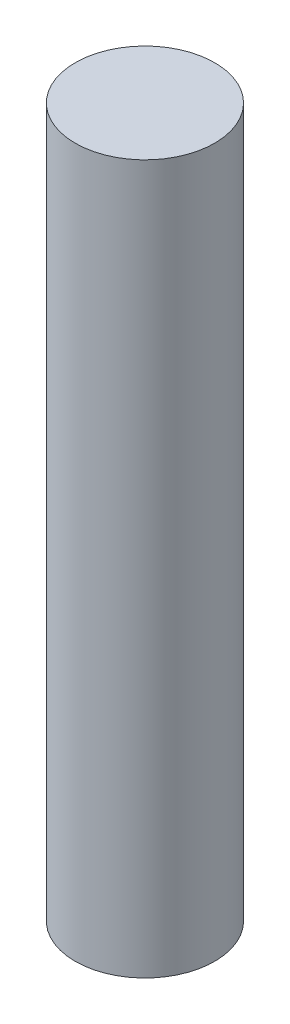
ISO-10303-21;
HEADER;
FILE_DESCRIPTION(('STEP AP214'),'2;1');
FILE_NAME('part.step','',(''),(''),'','','');
FILE_SCHEMA(('AUTOMOTIVE_DESIGN { 1 0 10303 214 1 1 1 1 }'));
ENDSEC;
DATA;
#1=APPLICATION_CONTEXT('core data for automotive mechanical design processes');
#2=APPLICATION_PROTOCOL_DEFINITION('international standard','automotive_design',2000,#1);
#3=PRODUCT_CONTEXT('',#1,'mechanical');
#4=PRODUCT('Part','Part','',(#3));
#5=PRODUCT_RELATED_PRODUCT_CATEGORY('part','',(#4));
#6=PRODUCT_DEFINITION_FORMATION('','',#4);
#7=PRODUCT_DEFINITION_CONTEXT('part definition',#1,'design');
#8=PRODUCT_DEFINITION('design','',#6,#7);
#9=PRODUCT_DEFINITION_SHAPE('','',#8);
#10=(LENGTH_UNIT() NAMED_UNIT(*) SI_UNIT(.MILLI.,.METRE.));
#11=(NAMED_UNIT(*) PLANE_ANGLE_UNIT() SI_UNIT($,.RADIAN.));
#12=(NAMED_UNIT(*) SI_UNIT($,.STERADIAN.) SOLID_ANGLE_UNIT());
#13=UNCERTAINTY_MEASURE_WITH_UNIT(LENGTH_MEASURE(1.E-05),#10,'distance_accuracy_value','');
#14=(GEOMETRIC_REPRESENTATION_CONTEXT(3) GLOBAL_UNCERTAINTY_ASSIGNED_CONTEXT((#13)) GLOBAL_UNIT_ASSIGNED_CONTEXT((#10,
#11,#12)) REPRESENTATION_CONTEXT('',''));
#15=CARTESIAN_POINT('',(0.,0.,0.));
#16=DIRECTION('',(0.,0.,1.));
#17=DIRECTION('',(1.,0.,0.));
#18=AXIS2_PLACEMENT_3D('',#15,#16,#17);
#19=CARTESIAN_POINT('',(0.,-95.758,0.));
#20=DIRECTION('',(0.,1.,0.));
#21=DIRECTION('',(0.,0.,1.));
#22=AXIS2_PLACEMENT_3D('',#19,#20,#21);
#23=CYLINDRICAL_SURFACE('',#22,3.);
#24=CARTESIAN_POINT('',(0.,-95.758,0.));
#25=DIRECTION('',(0.,1.,0.));
#26=DIRECTION('',(0.,0.,1.));
#27=AXIS2_PLACEMENT_3D('',#24,#25,#26);
#28=CIRCLE('',#27,3.);
#29=CARTESIAN_POINT('',(0.,-95.758,3.));
#30=VERTEX_POINT('',#29);
#31=EDGE_CURVE('E10',#30,#30,#28,.T.);
#32=CARTESIAN_POINT('',(0.,-65.278,0.));
#33=DIRECTION('',(0.,1.,0.));
#34=DIRECTION('',(0.,0.,1.));
#35=AXIS2_PLACEMENT_3D('',#32,#33,#34);
#36=CIRCLE('',#35,3.);
#37=CARTESIAN_POINT('',(0.,-65.278,3.));
#38=VERTEX_POINT('',#37);
#39=EDGE_CURVE('E40',#38,#38,#36,.T.);
#40=CARTESIAN_POINT('',(0.,-95.758,3.));
#41=CARTESIAN_POINT('',(0.,-95.4405,3.));
#42=CARTESIAN_POINT('',(0.,-95.123,3.));
#43=CARTESIAN_POINT('',(0.,-94.488,3.));
#44=CARTESIAN_POINT('',(0.,-94.1705,3.));
#45=CARTESIAN_POINT('',(0.,-93.5355,3.));
#46=CARTESIAN_POINT('',(0.,-93.218,3.));
#47=CARTESIAN_POINT('',(0.,-92.583,3.));
#48=CARTESIAN_POINT('',(0.,-92.2655,3.));
#49=CARTESIAN_POINT('',(0.,-91.6305,3.));
#50=CARTESIAN_POINT('',(0.,-91.313,3.));
#51=CARTESIAN_POINT('',(0.,-90.678,3.));
#52=CARTESIAN_POINT('',(0.,-90.3605,3.));
#53=CARTESIAN_POINT('',(0.,-89.7255,3.));
#54=CARTESIAN_POINT('',(0.,-89.408,3.));
#55=CARTESIAN_POINT('',(0.,-88.773,3.));
#56=CARTESIAN_POINT('',(0.,-88.4555,3.));
#57=CARTESIAN_POINT('',(0.,-87.8205,3.));
#58=CARTESIAN_POINT('',(0.,-87.503,3.));
#59=CARTESIAN_POINT('',(0.,-86.868,3.));
#60=CARTESIAN_POINT('',(0.,-86.5505,3.));
#61=CARTESIAN_POINT('',(0.,-85.9155,3.));
#62=CARTESIAN_POINT('',(0.,-85.598,3.));
#63=CARTESIAN_POINT('',(0.,-84.963,3.));
#64=CARTESIAN_POINT('',(0.,-84.6455,3.));
#65=CARTESIAN_POINT('',(0.,-84.0105,3.));
#66=CARTESIAN_POINT('',(0.,-83.693,3.));
#67=CARTESIAN_POINT('',(0.,-83.058,3.));
#68=CARTESIAN_POINT('',(0.,-82.7405,3.));
#69=CARTESIAN_POINT('',(0.,-82.1055,3.));
#70=CARTESIAN_POINT('',(0.,-81.788,3.));
#71=CARTESIAN_POINT('',(0.,-81.153,3.));
#72=CARTESIAN_POINT('',(0.,-80.8355,3.));
#73=CARTESIAN_POINT('',(0.,-80.2005,3.));
#74=CARTESIAN_POINT('',(0.,-79.883,3.));
#75=CARTESIAN_POINT('',(0.,-79.248,3.));
#76=CARTESIAN_POINT('',(0.,-78.9305,3.));
#77=CARTESIAN_POINT('',(0.,-78.2955,3.));
#78=CARTESIAN_POINT('',(0.,-77.978,3.));
#79=CARTESIAN_POINT('',(0.,-77.343,3.));
#80=CARTESIAN_POINT('',(0.,-77.0255,3.));
#81=CARTESIAN_POINT('',(0.,-76.3905,3.));
#82=CARTESIAN_POINT('',(0.,-76.073,3.));
#83=CARTESIAN_POINT('',(0.,-75.438,3.));
#84=CARTESIAN_POINT('',(0.,-75.1205,3.));
#85=CARTESIAN_POINT('',(0.,-74.4855,3.));
#86=CARTESIAN_POINT('',(0.,-74.168,3.));
#87=CARTESIAN_POINT('',(0.,-73.533,3.));
#88=CARTESIAN_POINT('',(0.,-73.2155,3.));
#89=CARTESIAN_POINT('',(0.,-72.5805,3.));
#90=CARTESIAN_POINT('',(0.,-72.263,3.));
#91=CARTESIAN_POINT('',(0.,-71.628,3.));
#92=CARTESIAN_POINT('',(0.,-71.3105,3.));
#93=CARTESIAN_POINT('',(0.,-70.6755,3.));
#94=CARTESIAN_POINT('',(0.,-70.358,3.));
#95=CARTESIAN_POINT('',(0.,-69.723,3.));
#96=CARTESIAN_POINT('',(0.,-69.4055,3.));
#97=CARTESIAN_POINT('',(0.,-68.7705,3.));
#98=CARTESIAN_POINT('',(0.,-68.453,3.));
#99=CARTESIAN_POINT('',(0.,-67.818,3.));
#100=CARTESIAN_POINT('',(0.,-67.5005,3.));
#101=CARTESIAN_POINT('',(0.,-66.8655,3.));
#102=CARTESIAN_POINT('',(0.,-66.548,3.));
#103=CARTESIAN_POINT('',(0.,-65.913,3.));
#104=CARTESIAN_POINT('',(0.,-65.5955,3.));
#105=CARTESIAN_POINT('',(0.,-65.278,3.));
#106=B_SPLINE_CURVE_WITH_KNOTS('',3,(#40,#41,#42,#43,#44,#45,#46,#47,#48,#49,#50,#51,#52,#53,
#54,#55,#56,#57,#58,#59,#60,#61,#62,#63,#64,#65,#66,#67,#68,#69,#70,#71,#72,#73,#74,#75,#76,#77,
#78,#79,#80,#81,#82,#83,#84,#85,#86,#87,#88,#89,#90,#91,#92,#93,#94,#95,#96,#97,#98,#99,#100,
#101,#102,#103,#104,#105),.UNSPECIFIED.,.F.,.F.,(4,2,2,2,2,2,2,2,2,2,2,2,2,2,2,2,2,2,2,2,2,2,2,
2,2,2,2,2,2,2,2,2,4),(0.,0.952500000000009,1.905,2.85750000000001,3.81000000000001,4.7625,
5.71500000000001,6.66750000000001,7.62,8.57250000000001,9.52500000000001,10.4775,11.43,12.3825,
13.335,14.2875,15.24,16.1925,17.145,18.0975,19.05,20.0025,20.955,21.9075,22.86,23.8125,24.765,
25.7175,26.67,27.6225,28.575,29.5275,30.48),.UNSPECIFIED.);
#107=EDGE_CURVE('BSEAM37',#30,#38,#106,.T.);
#108=ORIENTED_EDGE('',*,*,#31,.T.);
#109=ORIENTED_EDGE('',*,*,#39,.F.);
#110=ORIENTED_EDGE('',*,*,#107,.T.);
#111=ORIENTED_EDGE('',*,*,#107,.F.);
#112=EDGE_LOOP('',(#108,#110,#109,#111));
#113=FACE_BOUND('',#112,.T.);
#114=ADVANCED_FACE('F37',(#113),#23,.T.);
#115=CARTESIAN_POINT('',(0.,-95.758,0.));
#116=DIRECTION('',(0.,1.,0.));
#117=DIRECTION('',(0.,0.,1.));
#118=AXIS2_PLACEMENT_3D('',#115,#116,#117);
#119=PLANE('',#118);
#120=ORIENTED_EDGE('',*,*,#31,.F.);
#121=EDGE_LOOP('',(#120));
#122=FACE_BOUND('',#121,.T.);
#123=ADVANCED_FACE('F52',(#122),#119,.F.);
#124=CARTESIAN_POINT('',(0.,-65.278,0.));
#125=DIRECTION('',(0.,1.,0.));
#126=DIRECTION('',(0.,0.,1.));
#127=AXIS2_PLACEMENT_3D('',#124,#125,#126);
#128=PLANE('',#127);
#129=ORIENTED_EDGE('',*,*,#39,.T.);
#130=EDGE_LOOP('',(#129));
#131=FACE_BOUND('',#130,.T.);
#132=ADVANCED_FACE('F49',(#131),#128,.T.);
#133=CLOSED_SHELL('',(#114,#123,#132));
#134=MANIFOLD_SOLID_BREP('B2',#133);
#135=ADVANCED_BREP_SHAPE_REPRESENTATION('',(#18,#134),#14);
#136=SHAPE_DEFINITION_REPRESENTATION(#9,#135);
ENDSEC;
END-ISO-10303-21;
